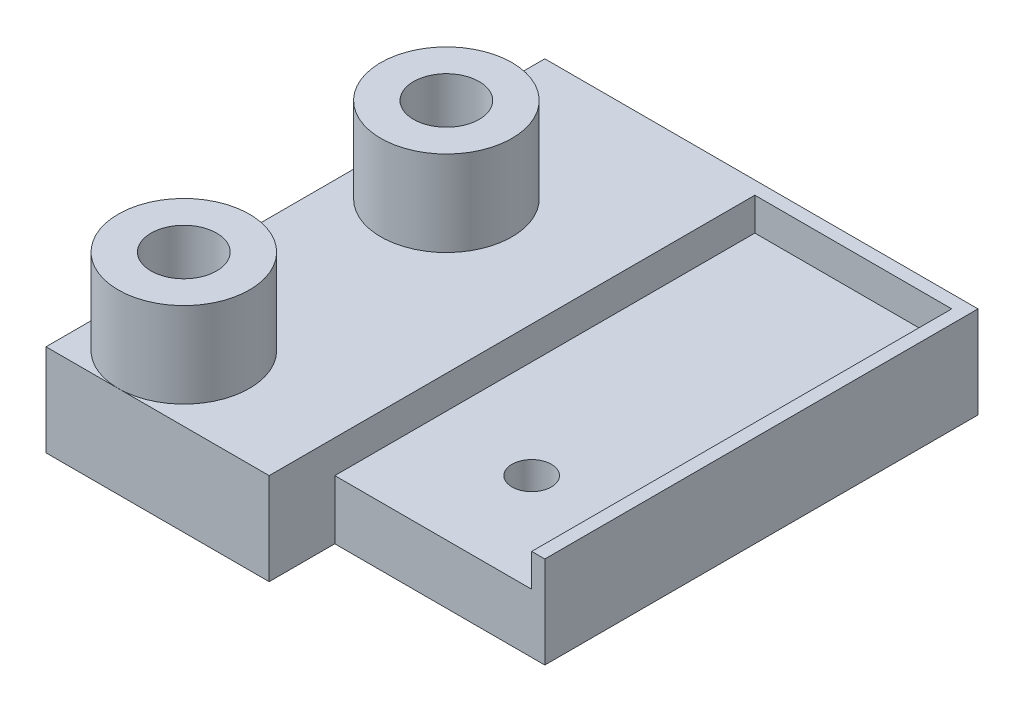
ISO-10303-21;
HEADER;
FILE_DESCRIPTION(('STEP AP214'),'2;1');
FILE_NAME('part.step','',(''),(''),'','','');
FILE_SCHEMA(('AUTOMOTIVE_DESIGN { 1 0 10303 214 1 1 1 1 }'));
ENDSEC;
DATA;
#1=APPLICATION_CONTEXT('core data for automotive mechanical design processes');
#2=APPLICATION_PROTOCOL_DEFINITION('international standard','automotive_design',2000,#1);
#3=PRODUCT_CONTEXT('',#1,'mechanical');
#4=PRODUCT('Part','Part','',(#3));
#5=PRODUCT_RELATED_PRODUCT_CATEGORY('part','',(#4));
#6=PRODUCT_DEFINITION_FORMATION('','',#4);
#7=PRODUCT_DEFINITION_CONTEXT('part definition',#1,'design');
#8=PRODUCT_DEFINITION('design','',#6,#7);
#9=PRODUCT_DEFINITION_SHAPE('','',#8);
#10=(LENGTH_UNIT() NAMED_UNIT(*) SI_UNIT(.MILLI.,.METRE.));
#11=(NAMED_UNIT(*) PLANE_ANGLE_UNIT() SI_UNIT($,.RADIAN.));
#12=(NAMED_UNIT(*) SI_UNIT($,.STERADIAN.) SOLID_ANGLE_UNIT());
#13=UNCERTAINTY_MEASURE_WITH_UNIT(LENGTH_MEASURE(1.E-05),#10,'distance_accuracy_value','');
#14=(GEOMETRIC_REPRESENTATION_CONTEXT(3) GLOBAL_UNCERTAINTY_ASSIGNED_CONTEXT((#13)) GLOBAL_UNIT_ASSIGNED_CONTEXT((#10,
#11,#12)) REPRESENTATION_CONTEXT('',''));
#15=CARTESIAN_POINT('',(0.,0.,0.));
#16=DIRECTION('',(0.,0.,1.));
#17=DIRECTION('',(1.,0.,0.));
#18=AXIS2_PLACEMENT_3D('',#15,#16,#17);
#19=CARTESIAN_POINT('',(0.,7.,0.));
#20=DIRECTION('',(0.,0.,-1.));
#21=DIRECTION('',(-1.,0.,0.));
#22=AXIS2_PLACEMENT_3D('',#19,#20,#21);
#23=PLANE('',#22);
#24=DIRECTION('',(0.,1.,0.));
#25=VECTOR('',#24,1.);
#26=CARTESIAN_POINT('',(-16.,-17.7200451466694,0.));
#27=LINE('',#26,#25);
#28=CARTESIAN_POINT('',(-16.,0.,0.));
#29=VERTEX_POINT('',#28);
#30=CARTESIAN_POINT('',(-16.,4.5,0.));
#31=VERTEX_POINT('',#30);
#32=EDGE_CURVE('E67',#29,#31,#27,.T.);
#33=ORIENTED_EDGE('',*,*,#32,.F.);
#34=DIRECTION('',(1.,0.,0.));
#35=VECTOR('',#34,1.);
#36=CARTESIAN_POINT('',(0.,0.,0.));
#37=LINE('',#36,#35);
#38=CARTESIAN_POINT('',(0.,0.,0.));
#39=VERTEX_POINT('',#38);
#40=EDGE_CURVE('E202',#29,#39,#37,.T.);
#41=ORIENTED_EDGE('',*,*,#40,.T.);
#42=DIRECTION('',(0.,-1.,0.));
#43=VECTOR('',#42,1.);
#44=CARTESIAN_POINT('',(0.,7.,0.));
#45=LINE('',#44,#43);
#46=CARTESIAN_POINT('',(0.,7.,0.));
#47=VERTEX_POINT('',#46);
#48=EDGE_CURVE('E207',#47,#39,#45,.T.);
#49=ORIENTED_EDGE('',*,*,#48,.F.);
#50=DIRECTION('',(1.,0.,0.));
#51=VECTOR('',#50,1.);
#52=CARTESIAN_POINT('',(0.,7.,0.));
#53=LINE('',#52,#51);
#54=CARTESIAN_POINT('',(-0.999999999999996,7.,0.));
#55=VERTEX_POINT('',#54);
#56=EDGE_CURVE('E132',#55,#47,#53,.T.);
#57=ORIENTED_EDGE('',*,*,#56,.F.);
#58=DIRECTION('',(0.,1.,0.));
#59=VECTOR('',#58,1.);
#60=CARTESIAN_POINT('',(-0.999999999999996,4.5,0.));
#61=LINE('',#60,#59);
#62=CARTESIAN_POINT('',(-0.999999999999996,4.5,0.));
#63=VERTEX_POINT('',#62);
#64=EDGE_CURVE('E189',#63,#55,#61,.T.);
#65=ORIENTED_EDGE('',*,*,#64,.F.);
#66=DIRECTION('',(1.,0.,0.));
#67=VECTOR('',#66,1.);
#68=CARTESIAN_POINT('',(-0.999999999999996,4.5,0.));
#69=LINE('',#68,#67);
#70=EDGE_CURVE('E174',#31,#63,#69,.T.);
#71=ORIENTED_EDGE('',*,*,#70,.F.);
#72=EDGE_LOOP('',(#33,#41,#49,#57,#65,#71));
#73=FACE_BOUND('',#72,.T.);
#74=ADVANCED_FACE('F45',(#73),#23,.F.);
#75=CARTESIAN_POINT('',(0.,7.,0.));
#76=DIRECTION('',(-1.,0.,0.));
#77=DIRECTION('',(0.,0.,1.));
#78=AXIS2_PLACEMENT_3D('',#75,#76,#77);
#79=PLANE('',#78);
#80=DIRECTION('',(0.,0.,-1.));
#81=VECTOR('',#80,1.);
#82=CARTESIAN_POINT('',(0.,0.,0.));
#83=LINE('',#82,#81);
#84=CARTESIAN_POINT('',(0.,0.,-33.));
#85=VERTEX_POINT('',#84);
#86=EDGE_CURVE('E192',#39,#85,#83,.T.);
#87=ORIENTED_EDGE('',*,*,#86,.T.);
#88=DIRECTION('',(0.,-1.,0.));
#89=VECTOR('',#88,1.);
#90=CARTESIAN_POINT('',(0.,7.,-33.));
#91=LINE('',#90,#89);
#92=CARTESIAN_POINT('',(0.,7.,-33.));
#93=VERTEX_POINT('',#92);
#94=EDGE_CURVE('E11',#93,#85,#91,.T.);
#95=ORIENTED_EDGE('',*,*,#94,.F.);
#96=DIRECTION('',(0.,0.,-1.));
#97=VECTOR('',#96,1.);
#98=CARTESIAN_POINT('',(0.,7.,0.));
#99=LINE('',#98,#97);
#100=EDGE_CURVE('E199',#47,#93,#99,.T.);
#101=ORIENTED_EDGE('',*,*,#100,.F.);
#102=ORIENTED_EDGE('',*,*,#48,.T.);
#103=EDGE_LOOP('',(#87,#95,#101,#102));
#104=FACE_BOUND('',#103,.T.);
#105=ADVANCED_FACE('F47',(#104),#79,.F.);
#106=CARTESIAN_POINT('',(0.,7.,-33.));
#107=DIRECTION('',(0.,0.,1.));
#108=DIRECTION('',(1.,0.,0.));
#109=AXIS2_PLACEMENT_3D('',#106,#107,#108);
#110=PLANE('',#109);
#111=DIRECTION('',(-1.,0.,0.));
#112=VECTOR('',#111,1.);
#113=CARTESIAN_POINT('',(0.,0.,-33.));
#114=LINE('',#113,#112);
#115=CARTESIAN_POINT('',(-33.,0.,-33.));
#116=VERTEX_POINT('',#115);
#117=EDGE_CURVE('E211',#85,#116,#114,.T.);
#118=ORIENTED_EDGE('',*,*,#117,.T.);
#119=DIRECTION('',(0.,-1.,0.));
#120=VECTOR('',#119,1.);
#121=CARTESIAN_POINT('',(-33.,7.,-33.));
#122=LINE('',#121,#120);
#123=CARTESIAN_POINT('',(-33.,7.,-33.));
#124=VERTEX_POINT('',#123);
#125=EDGE_CURVE('E55',#124,#116,#122,.T.);
#126=ORIENTED_EDGE('',*,*,#125,.F.);
#127=DIRECTION('',(-1.,0.,0.));
#128=VECTOR('',#127,1.);
#129=CARTESIAN_POINT('',(0.,7.,-33.));
#130=LINE('',#129,#128);
#131=EDGE_CURVE('E127',#93,#124,#130,.T.);
#132=ORIENTED_EDGE('',*,*,#131,.F.);
#133=ORIENTED_EDGE('',*,*,#94,.T.);
#134=EDGE_LOOP('',(#118,#126,#132,#133));
#135=FACE_BOUND('',#134,.T.);
#136=ADVANCED_FACE('F289',(#135),#110,.F.);
#137=CARTESIAN_POINT('',(-33.,7.,0.));
#138=DIRECTION('',(1.,0.,0.));
#139=DIRECTION('',(0.,0.,-1.));
#140=AXIS2_PLACEMENT_3D('',#137,#138,#139);
#141=PLANE('',#140);
#142=DIRECTION('',(0.,0.,1.));
#143=VECTOR('',#142,1.);
#144=CARTESIAN_POINT('',(-33.,0.,0.));
#145=LINE('',#144,#143);
#146=CARTESIAN_POINT('',(-33.,0.,5.));
#147=VERTEX_POINT('',#146);
#148=EDGE_CURVE('E138',#116,#147,#145,.T.);
#149=ORIENTED_EDGE('',*,*,#148,.T.);
#150=DIRECTION('',(0.,1.,0.));
#151=VECTOR('',#150,1.);
#152=CARTESIAN_POINT('',(-33.,-17.7200451466694,5.));
#153=LINE('',#152,#151);
#154=CARTESIAN_POINT('',(-33.,7.,5.));
#155=VERTEX_POINT('',#154);
#156=EDGE_CURVE('E135',#147,#155,#153,.T.);
#157=ORIENTED_EDGE('',*,*,#156,.T.);
#158=DIRECTION('',(0.,0.,1.));
#159=VECTOR('',#158,1.);
#160=CARTESIAN_POINT('',(-33.,7.,0.));
#161=LINE('',#160,#159);
#162=EDGE_CURVE('E121',#124,#155,#161,.T.);
#163=ORIENTED_EDGE('',*,*,#162,.F.);
#164=ORIENTED_EDGE('',*,*,#125,.T.);
#165=EDGE_LOOP('',(#149,#157,#163,#164));
#166=FACE_BOUND('',#165,.T.);
#167=ADVANCED_FACE('F136',(#166),#141,.F.);
#168=CARTESIAN_POINT('',(0.,7.,0.));
#169=DIRECTION('',(0.,1.,0.));
#170=DIRECTION('',(0.,0.,1.));
#171=AXIS2_PLACEMENT_3D('',#168,#169,#170);
#172=PLANE('',#171);
#173=CARTESIAN_POINT('',(-27.5,7.,-20.));
#174=DIRECTION('',(0.,1.,0.));
#175=DIRECTION('',(0.,0.,1.));
#176=AXIS2_PLACEMENT_3D('',#173,#174,#175);
#177=CIRCLE('',#176,5.);
#178=CARTESIAN_POINT('',(-27.5,7.,-25.));
#179=VERTEX_POINT('',#178);
#180=EDGE_CURVE('E231',#179,#179,#177,.T.);
#181=ORIENTED_EDGE('',*,*,#180,.F.);
#182=EDGE_LOOP('',(#181));
#183=FACE_BOUND('',#182,.T.);
#184=DIRECTION('',(1.,0.,0.));
#185=VECTOR('',#184,1.);
#186=CARTESIAN_POINT('',(-16.,7.,5.));
#187=LINE('',#186,#185);
#188=CARTESIAN_POINT('',(-27.5,7.,5.));
#189=VERTEX_POINT('',#188);
#190=EDGE_CURVE('E125',#155,#189,#187,.T.);
#191=ORIENTED_EDGE('',*,*,#190,.T.);
#192=CARTESIAN_POINT('',(-27.5,7.,0.));
#193=DIRECTION('',(0.,1.,0.));
#194=DIRECTION('',(0.,0.,1.));
#195=AXIS2_PLACEMENT_3D('',#192,#193,#194);
#196=CIRCLE('',#195,5.);
#197=EDGE_CURVE('E60',#189,#189,#196,.T.);
#198=ORIENTED_EDGE('',*,*,#197,.F.);
#199=CARTESIAN_POINT('',(-16.,7.,5.));
#200=VERTEX_POINT('',#199);
#201=EDGE_CURVE('E148',#189,#200,#187,.T.);
#202=ORIENTED_EDGE('',*,*,#201,.T.);
#203=DIRECTION('',(0.,0.,1.));
#204=VECTOR('',#203,1.);
#205=CARTESIAN_POINT('',(-16.,7.,-32.));
#206=LINE('',#205,#204);
#207=CARTESIAN_POINT('',(-16.,7.,-32.));
#208=VERTEX_POINT('',#207);
#209=EDGE_CURVE('E167',#208,#200,#206,.T.);
#210=ORIENTED_EDGE('',*,*,#209,.F.);
#211=DIRECTION('',(-1.,0.,0.));
#212=VECTOR('',#211,1.);
#213=CARTESIAN_POINT('',(-1.,7.,-32.));
#214=LINE('',#213,#212);
#215=CARTESIAN_POINT('',(-1.,7.,-32.));
#216=VERTEX_POINT('',#215);
#217=EDGE_CURVE('E182',#216,#208,#214,.T.);
#218=ORIENTED_EDGE('',*,*,#217,.F.);
#219=DIRECTION('',(0.,0.,-1.));
#220=VECTOR('',#219,1.);
#221=CARTESIAN_POINT('',(-1.,7.,-32.));
#222=LINE('',#221,#220);
#223=EDGE_CURVE('E179',#55,#216,#222,.T.);
#224=ORIENTED_EDGE('',*,*,#223,.F.);
#225=ORIENTED_EDGE('',*,*,#56,.T.);
#226=ORIENTED_EDGE('',*,*,#100,.T.);
#227=ORIENTED_EDGE('',*,*,#131,.T.);
#228=ORIENTED_EDGE('',*,*,#162,.T.);
#229=EDGE_LOOP('',(#191,#198,#202,#210,#218,#224,#225,#226,#227,#228));
#230=FACE_BOUND('',#229,.T.);
#231=ADVANCED_FACE('F123',(#183,#230),#172,.T.);
#232=CARTESIAN_POINT('',(0.,0.,0.));
#233=DIRECTION('',(0.,1.,0.));
#234=DIRECTION('',(0.,0.,1.));
#235=AXIS2_PLACEMENT_3D('',#232,#233,#234);
#236=PLANE('',#235);
#237=CARTESIAN_POINT('',(-27.5,0.,-20.));
#238=DIRECTION('',(0.,1.,0.));
#239=DIRECTION('',(0.,0.,1.));
#240=AXIS2_PLACEMENT_3D('',#237,#238,#239);
#241=CIRCLE('',#240,2.5);
#242=CARTESIAN_POINT('',(-27.5,0.,-22.5));
#243=VERTEX_POINT('',#242);
#244=EDGE_CURVE('E260',#243,#243,#241,.T.);
#245=ORIENTED_EDGE('',*,*,#244,.T.);
#246=EDGE_LOOP('',(#245));
#247=FACE_BOUND('',#246,.T.);
#248=CARTESIAN_POINT('',(-27.5,0.,0.));
#249=DIRECTION('',(0.,1.,0.));
#250=DIRECTION('',(0.,0.,1.));
#251=AXIS2_PLACEMENT_3D('',#248,#249,#250);
#252=CIRCLE('',#251,2.5);
#253=CARTESIAN_POINT('',(-27.5,0.,-2.5));
#254=VERTEX_POINT('',#253);
#255=EDGE_CURVE('E256',#254,#254,#252,.T.);
#256=ORIENTED_EDGE('',*,*,#255,.T.);
#257=EDGE_LOOP('',(#256));
#258=FACE_BOUND('',#257,.T.);
#259=CARTESIAN_POINT('',(-8.5,0.,-7.50000000000001));
#260=DIRECTION('',(0.,1.,0.));
#261=DIRECTION('',(0.,0.,1.));
#262=AXIS2_PLACEMENT_3D('',#259,#260,#261);
#263=CIRCLE('',#262,1.5);
#264=CARTESIAN_POINT('',(-8.5,0.,-6.00000000000001));
#265=VERTEX_POINT('',#264);
#266=EDGE_CURVE('E252',#265,#265,#263,.T.);
#267=ORIENTED_EDGE('',*,*,#266,.T.);
#268=EDGE_LOOP('',(#267));
#269=FACE_BOUND('',#268,.T.);
#270=ORIENTED_EDGE('',*,*,#86,.F.);
#271=ORIENTED_EDGE('',*,*,#40,.F.);
#272=DIRECTION('',(0.,0.,1.));
#273=VECTOR('',#272,1.);
#274=CARTESIAN_POINT('',(-16.,0.,0.));
#275=LINE('',#274,#273);
#276=CARTESIAN_POINT('',(-16.,0.,5.));
#277=VERTEX_POINT('',#276);
#278=EDGE_CURVE('E157',#29,#277,#275,.T.);
#279=ORIENTED_EDGE('',*,*,#278,.T.);
#280=DIRECTION('',(-1.,0.,0.));
#281=VECTOR('',#280,1.);
#282=CARTESIAN_POINT('',(-16.,0.,5.));
#283=LINE('',#282,#281);
#284=EDGE_CURVE('E160',#277,#147,#283,.T.);
#285=ORIENTED_EDGE('',*,*,#284,.T.);
#286=ORIENTED_EDGE('',*,*,#148,.F.);
#287=ORIENTED_EDGE('',*,*,#117,.F.);
#288=EDGE_LOOP('',(#270,#271,#279,#285,#286,#287));
#289=FACE_BOUND('',#288,.T.);
#290=ADVANCED_FACE('F225',(#247,#258,#269,#289),#236,.F.);
#291=CARTESIAN_POINT('',(-1.,4.5,-32.));
#292=DIRECTION('',(1.,0.,0.));
#293=DIRECTION('',(0.,0.,-1.));
#294=AXIS2_PLACEMENT_3D('',#291,#292,#293);
#295=PLANE('',#294);
#296=ORIENTED_EDGE('',*,*,#223,.T.);
#297=DIRECTION('',(0.,1.,0.));
#298=VECTOR('',#297,1.);
#299=CARTESIAN_POINT('',(-1.,4.5,-32.));
#300=LINE('',#299,#298);
#301=CARTESIAN_POINT('',(-1.,4.5,-32.));
#302=VERTEX_POINT('',#301);
#303=EDGE_CURVE('E178',#302,#216,#300,.T.);
#304=ORIENTED_EDGE('',*,*,#303,.F.);
#305=DIRECTION('',(0.,0.,-1.));
#306=VECTOR('',#305,1.);
#307=CARTESIAN_POINT('',(-1.,4.5,-32.));
#308=LINE('',#307,#306);
#309=EDGE_CURVE('E162',#63,#302,#308,.T.);
#310=ORIENTED_EDGE('',*,*,#309,.F.);
#311=ORIENTED_EDGE('',*,*,#64,.T.);
#312=EDGE_LOOP('',(#296,#304,#310,#311));
#313=FACE_BOUND('',#312,.T.);
#314=ADVANCED_FACE('F312',(#313),#295,.F.);
#315=CARTESIAN_POINT('',(-16.,4.5,-32.));
#316=DIRECTION('',(-1.,0.,0.));
#317=DIRECTION('',(0.,0.,1.));
#318=AXIS2_PLACEMENT_3D('',#315,#316,#317);
#319=PLANE('',#318);
#320=ORIENTED_EDGE('',*,*,#209,.T.);
#321=DIRECTION('',(0.,1.,0.));
#322=VECTOR('',#321,1.);
#323=CARTESIAN_POINT('',(-16.,-17.7200451466694,5.));
#324=LINE('',#323,#322);
#325=EDGE_CURVE('E143',#277,#200,#324,.T.);
#326=ORIENTED_EDGE('',*,*,#325,.F.);
#327=ORIENTED_EDGE('',*,*,#278,.F.);
#328=ORIENTED_EDGE('',*,*,#32,.T.);
#329=DIRECTION('',(0.,0.,1.));
#330=VECTOR('',#329,1.);
#331=CARTESIAN_POINT('',(-16.,4.5,-32.));
#332=LINE('',#331,#330);
#333=CARTESIAN_POINT('',(-16.,4.5,-32.));
#334=VERTEX_POINT('',#333);
#335=EDGE_CURVE('E171',#334,#31,#332,.T.);
#336=ORIENTED_EDGE('',*,*,#335,.F.);
#337=DIRECTION('',(0.,1.,0.));
#338=VECTOR('',#337,1.);
#339=CARTESIAN_POINT('',(-16.,4.5,-32.));
#340=LINE('',#339,#338);
#341=EDGE_CURVE('E193',#334,#208,#340,.T.);
#342=ORIENTED_EDGE('',*,*,#341,.T.);
#343=EDGE_LOOP('',(#320,#326,#327,#328,#336,#342));
#344=FACE_BOUND('',#343,.T.);
#345=ADVANCED_FACE('F302',(#344),#319,.F.);
#346=CARTESIAN_POINT('',(-1.,4.5,-32.));
#347=DIRECTION('',(0.,0.,-1.));
#348=DIRECTION('',(-1.,0.,0.));
#349=AXIS2_PLACEMENT_3D('',#346,#347,#348);
#350=PLANE('',#349);
#351=ORIENTED_EDGE('',*,*,#217,.T.);
#352=ORIENTED_EDGE('',*,*,#341,.F.);
#353=DIRECTION('',(-1.,0.,0.));
#354=VECTOR('',#353,1.);
#355=CARTESIAN_POINT('',(-1.,4.5,-32.));
#356=LINE('',#355,#354);
#357=EDGE_CURVE('E166',#302,#334,#356,.T.);
#358=ORIENTED_EDGE('',*,*,#357,.F.);
#359=ORIENTED_EDGE('',*,*,#303,.T.);
#360=EDGE_LOOP('',(#351,#352,#358,#359));
#361=FACE_BOUND('',#360,.T.);
#362=ADVANCED_FACE('F309',(#361),#350,.F.);
#363=CARTESIAN_POINT('',(0.,4.5,0.));
#364=DIRECTION('',(0.,-1.,0.));
#365=DIRECTION('',(0.,0.,-1.));
#366=AXIS2_PLACEMENT_3D('',#363,#364,#365);
#367=PLANE('',#366);
#368=CARTESIAN_POINT('',(-8.5,4.5,-7.50000000000001));
#369=DIRECTION('',(0.,-1.,0.));
#370=DIRECTION('',(0.,0.,-1.));
#371=AXIS2_PLACEMENT_3D('',#368,#369,#370);
#372=CIRCLE('',#371,1.5);
#373=CARTESIAN_POINT('',(-8.5,4.5,-9.00000000000001));
#374=VERTEX_POINT('',#373);
#375=EDGE_CURVE('E49',#374,#374,#372,.T.);
#376=ORIENTED_EDGE('',*,*,#375,.T.);
#377=EDGE_LOOP('',(#376));
#378=FACE_BOUND('',#377,.T.);
#379=ORIENTED_EDGE('',*,*,#309,.T.);
#380=ORIENTED_EDGE('',*,*,#357,.T.);
#381=ORIENTED_EDGE('',*,*,#335,.T.);
#382=ORIENTED_EDGE('',*,*,#70,.T.);
#383=EDGE_LOOP('',(#379,#380,#381,#382));
#384=FACE_BOUND('',#383,.T.);
#385=ADVANCED_FACE('F269',(#378,#384),#367,.F.);
#386=CARTESIAN_POINT('',(-16.,-17.7200451466694,5.));
#387=DIRECTION('',(0.,0.,1.));
#388=DIRECTION('',(1.,0.,0.));
#389=AXIS2_PLACEMENT_3D('',#386,#387,#388);
#390=PLANE('',#389);
#391=ORIENTED_EDGE('',*,*,#284,.F.);
#392=ORIENTED_EDGE('',*,*,#325,.T.);
#393=ORIENTED_EDGE('',*,*,#201,.F.);
#394=ORIENTED_EDGE('',*,*,#190,.F.);
#395=ORIENTED_EDGE('',*,*,#156,.F.);
#396=EDGE_LOOP('',(#391,#392,#393,#394,#395));
#397=FACE_BOUND('',#396,.T.);
#398=ADVANCED_FACE('F146',(#397),#390,.T.);
#399=CARTESIAN_POINT('',(-27.5,13.5,-20.));
#400=DIRECTION('',(0.,-1.,0.));
#401=DIRECTION('',(0.,0.,-1.));
#402=AXIS2_PLACEMENT_3D('',#399,#400,#401);
#403=CYLINDRICAL_SURFACE('',#402,2.5);
#404=CARTESIAN_POINT('',(-27.5,13.5,-20.));
#405=DIRECTION('',(0.,1.,0.));
#406=DIRECTION('',(0.,0.,1.));
#407=AXIS2_PLACEMENT_3D('',#404,#405,#406);
#408=CIRCLE('',#407,2.5);
#409=CARTESIAN_POINT('',(-27.5,13.5,-22.5));
#410=VERTEX_POINT('',#409);
#411=EDGE_CURVE('E235',#410,#410,#408,.T.);
#412=CARTESIAN_POINT('',(-27.5,13.5,-22.5));
#413=CARTESIAN_POINT('',(-27.5,13.359375,-22.5));
#414=CARTESIAN_POINT('',(-27.5,13.21875,-22.5));
#415=CARTESIAN_POINT('',(-27.5,12.9375,-22.5));
#416=CARTESIAN_POINT('',(-27.5,12.796875,-22.5));
#417=CARTESIAN_POINT('',(-27.5,12.515625,-22.5));
#418=CARTESIAN_POINT('',(-27.5,12.375,-22.5));
#419=CARTESIAN_POINT('',(-27.5,12.09375,-22.5));
#420=CARTESIAN_POINT('',(-27.5,11.953125,-22.5));
#421=CARTESIAN_POINT('',(-27.5,11.671875,-22.5));
#422=CARTESIAN_POINT('',(-27.5,11.53125,-22.5));
#423=CARTESIAN_POINT('',(-27.5,11.25,-22.5));
#424=CARTESIAN_POINT('',(-27.5,11.109375,-22.5));
#425=CARTESIAN_POINT('',(-27.5,10.828125,-22.5));
#426=CARTESIAN_POINT('',(-27.5,10.6875,-22.5));
#427=CARTESIAN_POINT('',(-27.5,10.40625,-22.5));
#428=CARTESIAN_POINT('',(-27.5,10.265625,-22.5));
#429=CARTESIAN_POINT('',(-27.5,9.984375,-22.5));
#430=CARTESIAN_POINT('',(-27.5,9.84375,-22.5));
#431=CARTESIAN_POINT('',(-27.5,9.5625,-22.5));
#432=CARTESIAN_POINT('',(-27.5,9.421875,-22.5));
#433=CARTESIAN_POINT('',(-27.5,9.140625,-22.5));
#434=CARTESIAN_POINT('',(-27.5,9.,-22.5));
#435=CARTESIAN_POINT('',(-27.5,8.71875,-22.5));
#436=CARTESIAN_POINT('',(-27.5,8.578125,-22.5));
#437=CARTESIAN_POINT('',(-27.5,8.296875,-22.5));
#438=CARTESIAN_POINT('',(-27.5,8.15625,-22.5));
#439=CARTESIAN_POINT('',(-27.5,7.875,-22.5));
#440=CARTESIAN_POINT('',(-27.5,7.734375,-22.5));
#441=CARTESIAN_POINT('',(-27.5,7.453125,-22.5));
#442=CARTESIAN_POINT('',(-27.5,7.3125,-22.5));
#443=CARTESIAN_POINT('',(-27.5,7.03125,-22.5));
#444=CARTESIAN_POINT('',(-27.5,6.890625,-22.5));
#445=CARTESIAN_POINT('',(-27.5,6.609375,-22.5));
#446=CARTESIAN_POINT('',(-27.5,6.46875,-22.5));
#447=CARTESIAN_POINT('',(-27.5,6.1875,-22.5));
#448=CARTESIAN_POINT('',(-27.5,6.046875,-22.5));
#449=CARTESIAN_POINT('',(-27.5,5.765625,-22.5));
#450=CARTESIAN_POINT('',(-27.5,5.625,-22.5));
#451=CARTESIAN_POINT('',(-27.5,5.34375,-22.5));
#452=CARTESIAN_POINT('',(-27.5,5.203125,-22.5));
#453=CARTESIAN_POINT('',(-27.5,4.921875,-22.5));
#454=CARTESIAN_POINT('',(-27.5,4.78125,-22.5));
#455=CARTESIAN_POINT('',(-27.5,4.5,-22.5));
#456=CARTESIAN_POINT('',(-27.5,4.359375,-22.5));
#457=CARTESIAN_POINT('',(-27.5,4.078125,-22.5));
#458=CARTESIAN_POINT('',(-27.5,3.9375,-22.5));
#459=CARTESIAN_POINT('',(-27.5,3.65625,-22.5));
#460=CARTESIAN_POINT('',(-27.5,3.515625,-22.5));
#461=CARTESIAN_POINT('',(-27.5,3.234375,-22.5));
#462=CARTESIAN_POINT('',(-27.5,3.09375,-22.5));
#463=CARTESIAN_POINT('',(-27.5,2.8125,-22.5));
#464=CARTESIAN_POINT('',(-27.5,2.671875,-22.5));
#465=CARTESIAN_POINT('',(-27.5,2.390625,-22.5));
#466=CARTESIAN_POINT('',(-27.5,2.25,-22.5));
#467=CARTESIAN_POINT('',(-27.5,1.96875,-22.5));
#468=CARTESIAN_POINT('',(-27.5,1.828125,-22.5));
#469=CARTESIAN_POINT('',(-27.5,1.546875,-22.5));
#470=CARTESIAN_POINT('',(-27.5,1.40625,-22.5));
#471=CARTESIAN_POINT('',(-27.5,1.125,-22.5));
#472=CARTESIAN_POINT('',(-27.5,0.984375,-22.5));
#473=CARTESIAN_POINT('',(-27.5,0.703125000000001,-22.5));
#474=CARTESIAN_POINT('',(-27.5,0.5625,-22.5));
#475=CARTESIAN_POINT('',(-27.5,0.28125,-22.5));
#476=CARTESIAN_POINT('',(-27.5,0.140625,-22.5));
#477=CARTESIAN_POINT('',(-27.5,0.,-22.5));
#478=B_SPLINE_CURVE_WITH_KNOTS('',3,(#412,#413,#414,#415,#416,#417,#418,#419,#420,#421,#422,
#423,#424,#425,#426,#427,#428,#429,#430,#431,#432,#433,#434,#435,#436,#437,#438,#439,#440,#441,
#442,#443,#444,#445,#446,#447,#448,#449,#450,#451,#452,#453,#454,#455,#456,#457,#458,#459,#460,
#461,#462,#463,#464,#465,#466,#467,#468,#469,#470,#471,#472,#473,#474,#475,#476,#477),
.UNSPECIFIED.,.F.,.F.,(4,2,2,2,2,2,2,2,2,2,2,2,2,2,2,2,2,2,2,2,2,2,2,2,2,2,2,2,2,2,2,2,4),(0.,
0.421874999999999,0.843749999999999,1.265625,1.6875,2.109375,2.53125,2.953125,3.375,3.796875,
4.21875,4.640625,5.0625,5.484375,5.90625,6.328125,6.75,7.171875,7.59375,8.015625,8.4375,
8.859375,9.28125,9.703125,10.125,10.546875,10.96875,11.390625,11.8125,12.234375,12.65625,
13.078125,13.5),.UNSPECIFIED.);
#479=EDGE_CURVE('BSEAM320',#410,#243,#478,.T.);
#480=ORIENTED_EDGE('',*,*,#411,.T.);
#481=ORIENTED_EDGE('',*,*,#244,.F.);
#482=ORIENTED_EDGE('',*,*,#479,.T.);
#483=ORIENTED_EDGE('',*,*,#479,.F.);
#484=EDGE_LOOP('',(#480,#482,#481,#483));
#485=FACE_BOUND('',#484,.T.);
#486=ADVANCED_FACE('F320',(#485),#403,.F.);
#487=CARTESIAN_POINT('',(-27.5,13.5,-20.));
#488=DIRECTION('',(0.,-1.,0.));
#489=DIRECTION('',(0.,0.,-1.));
#490=AXIS2_PLACEMENT_3D('',#487,#488,#489);
#491=CYLINDRICAL_SURFACE('',#490,5.);
#492=CARTESIAN_POINT('',(-27.5,13.5,-20.));
#493=DIRECTION('',(0.,1.,0.));
#494=DIRECTION('',(0.,0.,1.));
#495=AXIS2_PLACEMENT_3D('',#492,#493,#494);
#496=CIRCLE('',#495,5.);
#497=CARTESIAN_POINT('',(-27.5,13.5,-25.));
#498=VERTEX_POINT('',#497);
#499=EDGE_CURVE('E154',#498,#498,#496,.T.);
#500=CARTESIAN_POINT('',(-27.5,13.5,-25.));
#501=CARTESIAN_POINT('',(-27.5,13.4322916666667,-25.));
#502=CARTESIAN_POINT('',(-27.5,13.3645833333333,-25.));
#503=CARTESIAN_POINT('',(-27.5,13.2291666666667,-25.));
#504=CARTESIAN_POINT('',(-27.5,13.1614583333333,-25.));
#505=CARTESIAN_POINT('',(-27.5,13.0260416666667,-25.));
#506=CARTESIAN_POINT('',(-27.5,12.9583333333333,-25.));
#507=CARTESIAN_POINT('',(-27.5,12.8229166666667,-25.));
#508=CARTESIAN_POINT('',(-27.5,12.7552083333333,-25.));
#509=CARTESIAN_POINT('',(-27.5,12.6197916666667,-25.));
#510=CARTESIAN_POINT('',(-27.5,12.5520833333333,-25.));
#511=CARTESIAN_POINT('',(-27.5,12.4166666666667,-25.));
#512=CARTESIAN_POINT('',(-27.5,12.3489583333333,-25.));
#513=CARTESIAN_POINT('',(-27.5,12.2135416666667,-25.));
#514=CARTESIAN_POINT('',(-27.5,12.1458333333333,-25.));
#515=CARTESIAN_POINT('',(-27.5,12.0104166666667,-25.));
#516=CARTESIAN_POINT('',(-27.5,11.9427083333333,-25.));
#517=CARTESIAN_POINT('',(-27.5,11.8072916666667,-25.));
#518=CARTESIAN_POINT('',(-27.5,11.7395833333333,-25.));
#519=CARTESIAN_POINT('',(-27.5,11.6041666666667,-25.));
#520=CARTESIAN_POINT('',(-27.5,11.5364583333333,-25.));
#521=CARTESIAN_POINT('',(-27.5,11.4010416666667,-25.));
#522=CARTESIAN_POINT('',(-27.5,11.3333333333333,-25.));
#523=CARTESIAN_POINT('',(-27.5,11.1979166666667,-25.));
#524=CARTESIAN_POINT('',(-27.5,11.1302083333333,-25.));
#525=CARTESIAN_POINT('',(-27.5,10.9947916666667,-25.));
#526=CARTESIAN_POINT('',(-27.5,10.9270833333333,-25.));
#527=CARTESIAN_POINT('',(-27.5,10.7916666666667,-25.));
#528=CARTESIAN_POINT('',(-27.5,10.7239583333333,-25.));
#529=CARTESIAN_POINT('',(-27.5,10.5885416666667,-25.));
#530=CARTESIAN_POINT('',(-27.5,10.5208333333333,-25.));
#531=CARTESIAN_POINT('',(-27.5,10.3854166666667,-25.));
#532=CARTESIAN_POINT('',(-27.5,10.3177083333333,-25.));
#533=CARTESIAN_POINT('',(-27.5,10.1822916666667,-25.));
#534=CARTESIAN_POINT('',(-27.5,10.1145833333333,-25.));
#535=CARTESIAN_POINT('',(-27.5,9.97916666666667,-25.));
#536=CARTESIAN_POINT('',(-27.5,9.91145833333333,-25.));
#537=CARTESIAN_POINT('',(-27.5,9.77604166666667,-25.));
#538=CARTESIAN_POINT('',(-27.5,9.70833333333333,-25.));
#539=CARTESIAN_POINT('',(-27.5,9.57291666666667,-25.));
#540=CARTESIAN_POINT('',(-27.5,9.50520833333333,-25.));
#541=CARTESIAN_POINT('',(-27.5,9.36979166666667,-25.));
#542=CARTESIAN_POINT('',(-27.5,9.30208333333333,-25.));
#543=CARTESIAN_POINT('',(-27.5,9.16666666666667,-25.));
#544=CARTESIAN_POINT('',(-27.5,9.09895833333333,-25.));
#545=CARTESIAN_POINT('',(-27.5,8.96354166666667,-25.));
#546=CARTESIAN_POINT('',(-27.5,8.89583333333333,-25.));
#547=CARTESIAN_POINT('',(-27.5,8.76041666666667,-25.));
#548=CARTESIAN_POINT('',(-27.5,8.69270833333333,-25.));
#549=CARTESIAN_POINT('',(-27.5,8.55729166666667,-25.));
#550=CARTESIAN_POINT('',(-27.5,8.48958333333333,-25.));
#551=CARTESIAN_POINT('',(-27.5,8.35416666666667,-25.));
#552=CARTESIAN_POINT('',(-27.5,8.28645833333333,-25.));
#553=CARTESIAN_POINT('',(-27.5,8.15104166666667,-25.));
#554=CARTESIAN_POINT('',(-27.5,8.08333333333333,-25.));
#555=CARTESIAN_POINT('',(-27.5,7.94791666666667,-25.));
#556=CARTESIAN_POINT('',(-27.5,7.88020833333333,-25.));
#557=CARTESIAN_POINT('',(-27.5,7.74479166666667,-25.));
#558=CARTESIAN_POINT('',(-27.5,7.67708333333333,-25.));
#559=CARTESIAN_POINT('',(-27.5,7.54166666666667,-25.));
#560=CARTESIAN_POINT('',(-27.5,7.47395833333333,-25.));
#561=CARTESIAN_POINT('',(-27.5,7.33854166666667,-25.));
#562=CARTESIAN_POINT('',(-27.5,7.27083333333333,-25.));
#563=CARTESIAN_POINT('',(-27.5,7.13541666666667,-25.));
#564=CARTESIAN_POINT('',(-27.5,7.06770833333333,-25.));
#565=CARTESIAN_POINT('',(-27.5,7.,-25.));
#566=B_SPLINE_CURVE_WITH_KNOTS('',3,(#500,#501,#502,#503,#504,#505,#506,#507,#508,#509,#510,
#511,#512,#513,#514,#515,#516,#517,#518,#519,#520,#521,#522,#523,#524,#525,#526,#527,#528,#529,
#530,#531,#532,#533,#534,#535,#536,#537,#538,#539,#540,#541,#542,#543,#544,#545,#546,#547,#548,
#549,#550,#551,#552,#553,#554,#555,#556,#557,#558,#559,#560,#561,#562,#563,#564,#565),
.UNSPECIFIED.,.F.,.F.,(4,2,2,2,2,2,2,2,2,2,2,2,2,2,2,2,2,2,2,2,2,2,2,2,2,2,2,2,2,2,2,2,4),(0.,
0.203124999999998,0.406249999999999,0.609374999999999,0.812499999999999,1.015625,1.21875,
1.421875,1.625,1.828125,2.03125,2.234375,2.4375,2.640625,2.84375,3.046875,3.25,3.453125,3.65625,
3.859375,4.0625,4.265625,4.46875,4.671875,4.875,5.078125,5.28125,5.484375,5.6875,5.890625,
6.09375,6.296875,6.5),.UNSPECIFIED.);
#567=EDGE_CURVE('BSEAM335',#498,#179,#566,.T.);
#568=ORIENTED_EDGE('',*,*,#499,.F.);
#569=ORIENTED_EDGE('',*,*,#180,.T.);
#570=ORIENTED_EDGE('',*,*,#567,.T.);
#571=ORIENTED_EDGE('',*,*,#567,.F.);
#572=EDGE_LOOP('',(#568,#570,#569,#571));
#573=FACE_BOUND('',#572,.T.);
#574=ADVANCED_FACE('F335',(#573),#491,.T.);
#575=CARTESIAN_POINT('',(0.,13.5,0.));
#576=DIRECTION('',(0.,1.,0.));
#577=DIRECTION('',(0.,0.,1.));
#578=AXIS2_PLACEMENT_3D('',#575,#576,#577);
#579=PLANE('',#578);
#580=ORIENTED_EDGE('',*,*,#411,.F.);
#581=EDGE_LOOP('',(#580));
#582=FACE_BOUND('',#581,.T.);
#583=ORIENTED_EDGE('',*,*,#499,.T.);
#584=EDGE_LOOP('',(#583));
#585=FACE_BOUND('',#584,.T.);
#586=ADVANCED_FACE('F337',(#582,#585),#579,.T.);
#587=CARTESIAN_POINT('',(-27.5,13.5,0.));
#588=DIRECTION('',(0.,-1.,0.));
#589=DIRECTION('',(0.,0.,-1.));
#590=AXIS2_PLACEMENT_3D('',#587,#588,#589);
#591=CYLINDRICAL_SURFACE('',#590,2.5);
#592=CARTESIAN_POINT('',(-27.5,13.5,0.));
#593=DIRECTION('',(0.,1.,0.));
#594=DIRECTION('',(0.,0.,1.));
#595=AXIS2_PLACEMENT_3D('',#592,#593,#594);
#596=CIRCLE('',#595,2.5);
#597=CARTESIAN_POINT('',(-27.5,13.5,-2.5));
#598=VERTEX_POINT('',#597);
#599=EDGE_CURVE('E245',#598,#598,#596,.T.);
#600=CARTESIAN_POINT('',(-27.5,13.5,-2.5));
#601=CARTESIAN_POINT('',(-27.5,13.359375,-2.5));
#602=CARTESIAN_POINT('',(-27.5,13.21875,-2.5));
#603=CARTESIAN_POINT('',(-27.5,12.9375,-2.5));
#604=CARTESIAN_POINT('',(-27.5,12.796875,-2.5));
#605=CARTESIAN_POINT('',(-27.5,12.515625,-2.5));
#606=CARTESIAN_POINT('',(-27.5,12.375,-2.5));
#607=CARTESIAN_POINT('',(-27.5,12.09375,-2.5));
#608=CARTESIAN_POINT('',(-27.5,11.953125,-2.5));
#609=CARTESIAN_POINT('',(-27.5,11.671875,-2.5));
#610=CARTESIAN_POINT('',(-27.5,11.53125,-2.5));
#611=CARTESIAN_POINT('',(-27.5,11.25,-2.5));
#612=CARTESIAN_POINT('',(-27.5,11.109375,-2.5));
#613=CARTESIAN_POINT('',(-27.5,10.828125,-2.5));
#614=CARTESIAN_POINT('',(-27.5,10.6875,-2.5));
#615=CARTESIAN_POINT('',(-27.5,10.40625,-2.5));
#616=CARTESIAN_POINT('',(-27.5,10.265625,-2.5));
#617=CARTESIAN_POINT('',(-27.5,9.984375,-2.5));
#618=CARTESIAN_POINT('',(-27.5,9.84375,-2.5));
#619=CARTESIAN_POINT('',(-27.5,9.5625,-2.5));
#620=CARTESIAN_POINT('',(-27.5,9.421875,-2.5));
#621=CARTESIAN_POINT('',(-27.5,9.140625,-2.5));
#622=CARTESIAN_POINT('',(-27.5,9.,-2.5));
#623=CARTESIAN_POINT('',(-27.5,8.71875,-2.5));
#624=CARTESIAN_POINT('',(-27.5,8.578125,-2.5));
#625=CARTESIAN_POINT('',(-27.5,8.296875,-2.5));
#626=CARTESIAN_POINT('',(-27.5,8.15625,-2.5));
#627=CARTESIAN_POINT('',(-27.5,7.875,-2.5));
#628=CARTESIAN_POINT('',(-27.5,7.734375,-2.5));
#629=CARTESIAN_POINT('',(-27.5,7.453125,-2.5));
#630=CARTESIAN_POINT('',(-27.5,7.3125,-2.5));
#631=CARTESIAN_POINT('',(-27.5,7.03125,-2.5));
#632=CARTESIAN_POINT('',(-27.5,6.890625,-2.5));
#633=CARTESIAN_POINT('',(-27.5,6.609375,-2.5));
#634=CARTESIAN_POINT('',(-27.5,6.46875,-2.5));
#635=CARTESIAN_POINT('',(-27.5,6.1875,-2.5));
#636=CARTESIAN_POINT('',(-27.5,6.046875,-2.5));
#637=CARTESIAN_POINT('',(-27.5,5.765625,-2.5));
#638=CARTESIAN_POINT('',(-27.5,5.625,-2.5));
#639=CARTESIAN_POINT('',(-27.5,5.34375,-2.5));
#640=CARTESIAN_POINT('',(-27.5,5.203125,-2.5));
#641=CARTESIAN_POINT('',(-27.5,4.921875,-2.5));
#642=CARTESIAN_POINT('',(-27.5,4.78125,-2.5));
#643=CARTESIAN_POINT('',(-27.5,4.5,-2.5));
#644=CARTESIAN_POINT('',(-27.5,4.359375,-2.5));
#645=CARTESIAN_POINT('',(-27.5,4.078125,-2.5));
#646=CARTESIAN_POINT('',(-27.5,3.9375,-2.5));
#647=CARTESIAN_POINT('',(-27.5,3.65625,-2.5));
#648=CARTESIAN_POINT('',(-27.5,3.515625,-2.5));
#649=CARTESIAN_POINT('',(-27.5,3.234375,-2.5));
#650=CARTESIAN_POINT('',(-27.5,3.09375,-2.5));
#651=CARTESIAN_POINT('',(-27.5,2.8125,-2.5));
#652=CARTESIAN_POINT('',(-27.5,2.671875,-2.5));
#653=CARTESIAN_POINT('',(-27.5,2.390625,-2.5));
#654=CARTESIAN_POINT('',(-27.5,2.25,-2.5));
#655=CARTESIAN_POINT('',(-27.5,1.96875,-2.5));
#656=CARTESIAN_POINT('',(-27.5,1.828125,-2.5));
#657=CARTESIAN_POINT('',(-27.5,1.546875,-2.5));
#658=CARTESIAN_POINT('',(-27.5,1.40625,-2.5));
#659=CARTESIAN_POINT('',(-27.5,1.125,-2.5));
#660=CARTESIAN_POINT('',(-27.5,0.984375,-2.5));
#661=CARTESIAN_POINT('',(-27.5,0.703125000000001,-2.5));
#662=CARTESIAN_POINT('',(-27.5,0.5625,-2.5));
#663=CARTESIAN_POINT('',(-27.5,0.28125,-2.5));
#664=CARTESIAN_POINT('',(-27.5,0.140625,-2.5));
#665=CARTESIAN_POINT('',(-27.5,0.,-2.5));
#666=B_SPLINE_CURVE_WITH_KNOTS('',3,(#600,#601,#602,#603,#604,#605,#606,#607,#608,#609,#610,
#611,#612,#613,#614,#615,#616,#617,#618,#619,#620,#621,#622,#623,#624,#625,#626,#627,#628,#629,
#630,#631,#632,#633,#634,#635,#636,#637,#638,#639,#640,#641,#642,#643,#644,#645,#646,#647,#648,
#649,#650,#651,#652,#653,#654,#655,#656,#657,#658,#659,#660,#661,#662,#663,#664,#665),
.UNSPECIFIED.,.F.,.F.,(4,2,2,2,2,2,2,2,2,2,2,2,2,2,2,2,2,2,2,2,2,2,2,2,2,2,2,2,2,2,2,2,4),(0.,
0.421874999999999,0.843749999999999,1.265625,1.6875,2.109375,2.53125,2.953125,3.375,3.796875,
4.21875,4.640625,5.0625,5.484375,5.90625,6.328125,6.75,7.171875,7.59375,8.015625,8.4375,
8.859375,9.28125,9.703125,10.125,10.546875,10.96875,11.390625,11.8125,12.234375,12.65625,
13.078125,13.5),.UNSPECIFIED.);
#667=EDGE_CURVE('BSEAM344',#598,#254,#666,.T.);
#668=ORIENTED_EDGE('',*,*,#599,.T.);
#669=ORIENTED_EDGE('',*,*,#255,.F.);
#670=ORIENTED_EDGE('',*,*,#667,.T.);
#671=ORIENTED_EDGE('',*,*,#667,.F.);
#672=EDGE_LOOP('',(#668,#670,#669,#671));
#673=FACE_BOUND('',#672,.T.);
#674=ADVANCED_FACE('F344',(#673),#591,.F.);
#675=CARTESIAN_POINT('',(-27.5,13.5,0.));
#676=DIRECTION('',(0.,-1.,0.));
#677=DIRECTION('',(0.,0.,-1.));
#678=AXIS2_PLACEMENT_3D('',#675,#676,#677);
#679=CYLINDRICAL_SURFACE('',#678,5.);
#680=CARTESIAN_POINT('',(-27.5,13.5,0.));
#681=DIRECTION('',(0.,1.,0.));
#682=DIRECTION('',(0.,0.,1.));
#683=AXIS2_PLACEMENT_3D('',#680,#681,#682);
#684=CIRCLE('',#683,5.);
#685=CARTESIAN_POINT('',(-27.5,13.5,5.));
#686=VERTEX_POINT('',#685);
#687=EDGE_CURVE('E236',#686,#686,#684,.T.);
#688=ORIENTED_EDGE('',*,*,#687,.F.);
#689=EDGE_LOOP('',(#688));
#690=FACE_BOUND('',#689,.T.);
#691=ORIENTED_EDGE('',*,*,#197,.T.);
#692=EDGE_LOOP('',(#691));
#693=FACE_BOUND('',#692,.T.);
#694=ADVANCED_FACE('F280',(#690,#693),#679,.T.);
#695=CARTESIAN_POINT('',(0.,13.5,0.));
#696=DIRECTION('',(0.,1.,0.));
#697=DIRECTION('',(0.,0.,1.));
#698=AXIS2_PLACEMENT_3D('',#695,#696,#697);
#699=PLANE('',#698);
#700=ORIENTED_EDGE('',*,*,#599,.F.);
#701=EDGE_LOOP('',(#700));
#702=FACE_BOUND('',#701,.T.);
#703=ORIENTED_EDGE('',*,*,#687,.T.);
#704=EDGE_LOOP('',(#703));
#705=FACE_BOUND('',#704,.T.);
#706=ADVANCED_FACE('F274',(#702,#705),#699,.T.);
#707=CARTESIAN_POINT('',(-8.5,0.,-7.50000000000001));
#708=DIRECTION('',(0.,1.,0.));
#709=DIRECTION('',(0.,0.,1.));
#710=AXIS2_PLACEMENT_3D('',#707,#708,#709);
#711=CYLINDRICAL_SURFACE('',#710,1.5);
#712=ORIENTED_EDGE('',*,*,#266,.F.);
#713=EDGE_LOOP('',(#712));
#714=FACE_BOUND('',#713,.T.);
#715=ORIENTED_EDGE('',*,*,#375,.F.);
#716=EDGE_LOOP('',(#715));
#717=FACE_BOUND('',#716,.T.);
#718=ADVANCED_FACE('F272',(#714,#717),#711,.F.);
#719=CLOSED_SHELL('',(#74,#105,#136,#167,#231,#290,#314,#345,#362,#385,#398,#486,#574,#586,#674,
#694,#706,#718));
#720=MANIFOLD_SOLID_BREP('B2',#719);
#721=ADVANCED_BREP_SHAPE_REPRESENTATION('',(#18,#720),#14);
#722=SHAPE_DEFINITION_REPRESENTATION(#9,#721);
ENDSEC;
END-ISO-10303-21;
